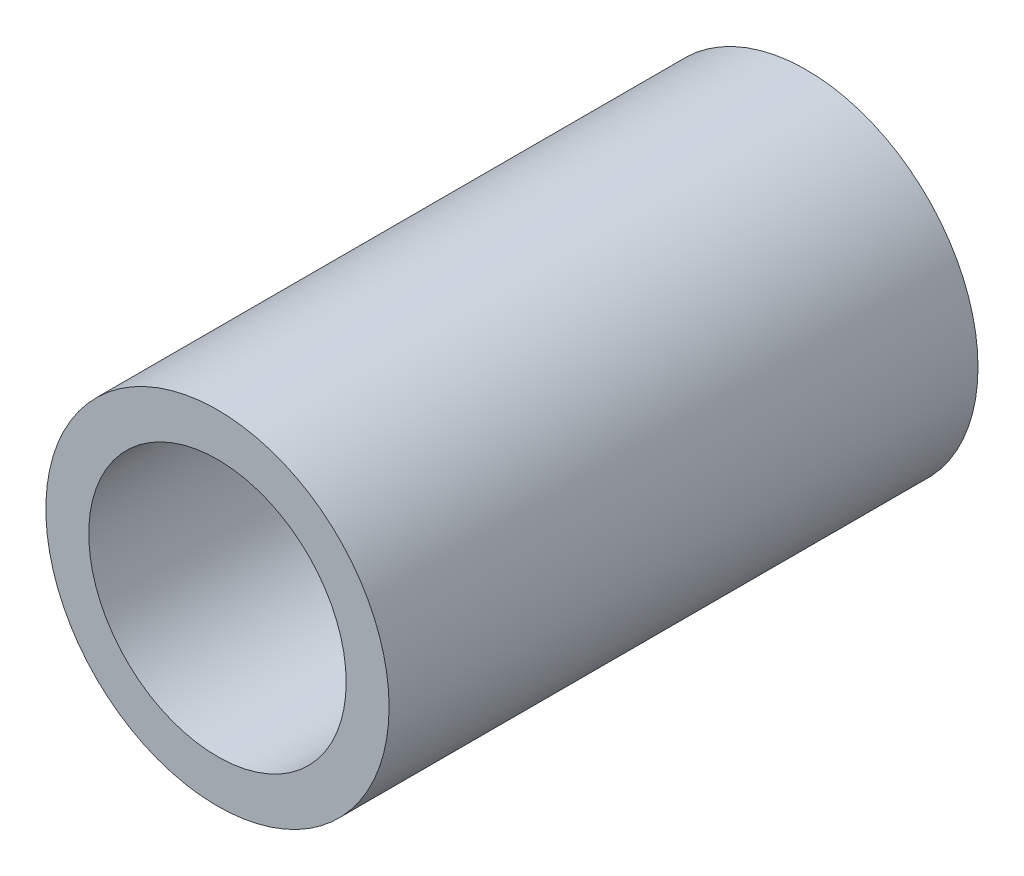
ISO-10303-21;
HEADER;
FILE_DESCRIPTION(('STEP AP214'),'2;1');
FILE_NAME('part.step','',(''),(''),'','','');
FILE_SCHEMA(('AUTOMOTIVE_DESIGN { 1 0 10303 214 1 1 1 1 }'));
ENDSEC;
DATA;
#1=APPLICATION_CONTEXT('core data for automotive mechanical design processes');
#2=APPLICATION_PROTOCOL_DEFINITION('international standard','automotive_design',2000,#1);
#3=PRODUCT_CONTEXT('',#1,'mechanical');
#4=PRODUCT('Part','Part','',(#3));
#5=PRODUCT_RELATED_PRODUCT_CATEGORY('part','',(#4));
#6=PRODUCT_DEFINITION_FORMATION('','',#4);
#7=PRODUCT_DEFINITION_CONTEXT('part definition',#1,'design');
#8=PRODUCT_DEFINITION('design','',#6,#7);
#9=PRODUCT_DEFINITION_SHAPE('','',#8);
#10=(LENGTH_UNIT() NAMED_UNIT(*) SI_UNIT(.MILLI.,.METRE.));
#11=(NAMED_UNIT(*) PLANE_ANGLE_UNIT() SI_UNIT($,.RADIAN.));
#12=(NAMED_UNIT(*) SI_UNIT($,.STERADIAN.) SOLID_ANGLE_UNIT());
#13=UNCERTAINTY_MEASURE_WITH_UNIT(LENGTH_MEASURE(1.E-05),#10,'distance_accuracy_value','');
#14=(GEOMETRIC_REPRESENTATION_CONTEXT(3) GLOBAL_UNCERTAINTY_ASSIGNED_CONTEXT((#13)) GLOBAL_UNIT_ASSIGNED_CONTEXT((#10,
#11,#12)) REPRESENTATION_CONTEXT('',''));
#15=CARTESIAN_POINT('',(0.,0.,0.));
#16=DIRECTION('',(0.,0.,1.));
#17=DIRECTION('',(1.,0.,0.));
#18=AXIS2_PLACEMENT_3D('',#15,#16,#17);
#19=CARTESIAN_POINT('',(0.,0.,64.4960244842766));
#20=DIRECTION('',(0.,0.,-1.));
#21=DIRECTION('',(-1.,0.,0.));
#22=AXIS2_PLACEMENT_3D('',#19,#20,#21);
#23=CYLINDRICAL_SURFACE('',#22,12.7);
#24=CARTESIAN_POINT('',(0.,0.,28.575));
#25=DIRECTION('',(0.,0.,1.));
#26=DIRECTION('',(1.,0.,0.));
#27=AXIS2_PLACEMENT_3D('',#24,#25,#26);
#28=CIRCLE('',#27,12.7);
#29=CARTESIAN_POINT('',(12.7,0.,28.575));
#30=VERTEX_POINT('',#29);
#31=EDGE_CURVE('E10',#30,#30,#28,.T.);
#32=ORIENTED_EDGE('',*,*,#31,.F.);
#33=EDGE_LOOP('',(#32));
#34=FACE_BOUND('',#33,.T.);
#35=CARTESIAN_POINT('',(0.,0.,-15.005));
#36=DIRECTION('',(0.,0.,1.));
#37=DIRECTION('',(1.,0.,0.));
#38=AXIS2_PLACEMENT_3D('',#35,#36,#37);
#39=CIRCLE('',#38,12.7);
#40=CARTESIAN_POINT('',(12.7,0.,-15.005));
#41=VERTEX_POINT('',#40);
#42=EDGE_CURVE('E48',#41,#41,#39,.T.);
#43=ORIENTED_EDGE('',*,*,#42,.T.);
#44=EDGE_LOOP('',(#43));
#45=FACE_BOUND('',#44,.T.);
#46=ADVANCED_FACE('F37',(#34,#45),#23,.T.);
#47=CARTESIAN_POINT('',(0.,0.,28.575));
#48=DIRECTION('',(0.,0.,1.));
#49=DIRECTION('',(1.,0.,0.));
#50=AXIS2_PLACEMENT_3D('',#47,#48,#49);
#51=PLANE('',#50);
#52=CARTESIAN_POINT('',(0.,0.,28.575));
#53=DIRECTION('',(0.,0.,1.));
#54=DIRECTION('',(1.,0.,0.));
#55=AXIS2_PLACEMENT_3D('',#52,#53,#54);
#56=CIRCLE('',#55,9.525);
#57=CARTESIAN_POINT('',(9.525,0.,28.575));
#58=VERTEX_POINT('',#57);
#59=EDGE_CURVE('E44',#58,#58,#56,.T.);
#60=ORIENTED_EDGE('',*,*,#59,.F.);
#61=EDGE_LOOP('',(#60));
#62=FACE_BOUND('',#61,.T.);
#63=ORIENTED_EDGE('',*,*,#31,.T.);
#64=EDGE_LOOP('',(#63));
#65=FACE_BOUND('',#64,.T.);
#66=ADVANCED_FACE('F39',(#62,#65),#51,.T.);
#67=CARTESIAN_POINT('',(0.,0.,0.));
#68=DIRECTION('',(0.,0.,1.));
#69=DIRECTION('',(1.,0.,0.));
#70=AXIS2_PLACEMENT_3D('',#67,#68,#69);
#71=CYLINDRICAL_SURFACE('',#70,9.525);
#72=ORIENTED_EDGE('',*,*,#59,.T.);
#73=EDGE_LOOP('',(#72));
#74=FACE_BOUND('',#73,.T.);
#75=CARTESIAN_POINT('',(0.,0.,-15.005));
#76=DIRECTION('',(0.,0.,1.));
#77=DIRECTION('',(1.,0.,0.));
#78=AXIS2_PLACEMENT_3D('',#75,#76,#77);
#79=CIRCLE('',#78,9.525);
#80=CARTESIAN_POINT('',(9.525,0.,-15.005));
#81=VERTEX_POINT('',#80);
#82=EDGE_CURVE('E52',#81,#81,#79,.T.);
#83=ORIENTED_EDGE('',*,*,#82,.F.);
#84=EDGE_LOOP('',(#83));
#85=FACE_BOUND('',#84,.T.);
#86=ADVANCED_FACE('F61',(#74,#85),#71,.F.);
#87=CARTESIAN_POINT('',(0.,0.,-15.005));
#88=DIRECTION('',(0.,0.,1.));
#89=DIRECTION('',(1.,0.,0.));
#90=AXIS2_PLACEMENT_3D('',#87,#88,#89);
#91=PLANE('',#90);
#92=ORIENTED_EDGE('',*,*,#82,.T.);
#93=EDGE_LOOP('',(#92));
#94=FACE_BOUND('',#93,.T.);
#95=ORIENTED_EDGE('',*,*,#42,.F.);
#96=EDGE_LOOP('',(#95));
#97=FACE_BOUND('',#96,.T.);
#98=ADVANCED_FACE('F58',(#94,#97),#91,.F.);
#99=CLOSED_SHELL('',(#46,#66,#86,#98));
#100=MANIFOLD_SOLID_BREP('B2',#99);
#101=ADVANCED_BREP_SHAPE_REPRESENTATION('',(#18,#100),#14);
#102=SHAPE_DEFINITION_REPRESENTATION(#9,#101);
ENDSEC;
END-ISO-10303-21;
